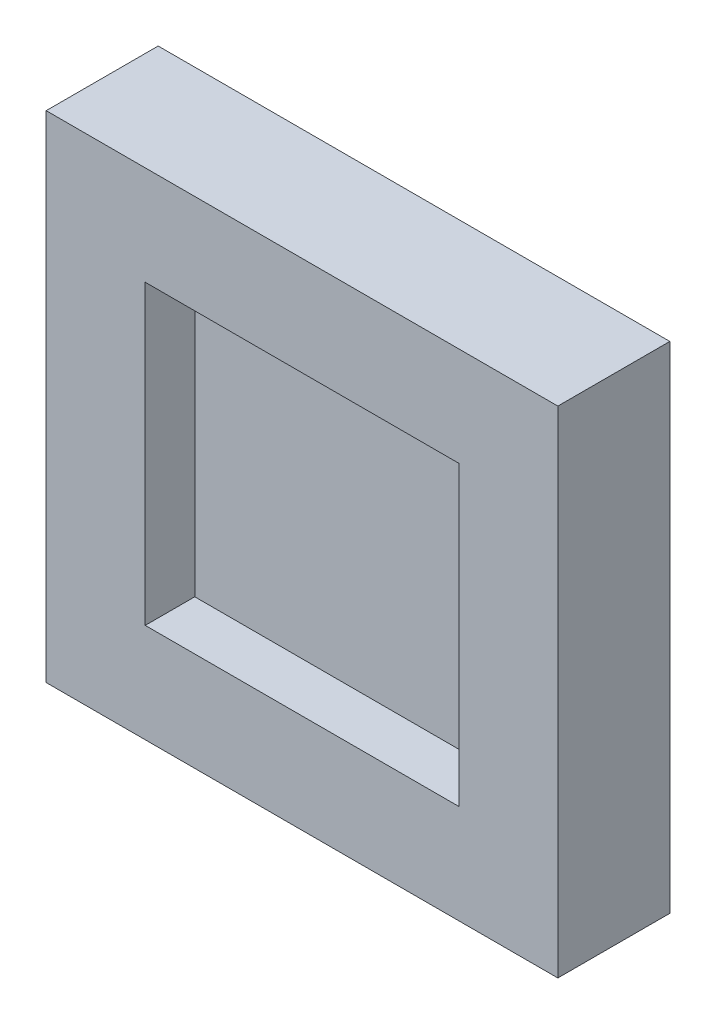
ISO-10303-21;
HEADER;
FILE_DESCRIPTION(('STEP AP214'),'2;1');
FILE_NAME('part.step','',(''),(''),'','','');
FILE_SCHEMA(('AUTOMOTIVE_DESIGN { 1 0 10303 214 1 1 1 1 }'));
ENDSEC;
DATA;
#1=APPLICATION_CONTEXT('core data for automotive mechanical design processes');
#2=APPLICATION_PROTOCOL_DEFINITION('international standard','automotive_design',2000,#1);
#3=PRODUCT_CONTEXT('',#1,'mechanical');
#4=PRODUCT('Part','Part','',(#3));
#5=PRODUCT_RELATED_PRODUCT_CATEGORY('part','',(#4));
#6=PRODUCT_DEFINITION_FORMATION('','',#4);
#7=PRODUCT_DEFINITION_CONTEXT('part definition',#1,'design');
#8=PRODUCT_DEFINITION('design','',#6,#7);
#9=PRODUCT_DEFINITION_SHAPE('','',#8);
#10=(LENGTH_UNIT() NAMED_UNIT(*) SI_UNIT(.MILLI.,.METRE.));
#11=(NAMED_UNIT(*) PLANE_ANGLE_UNIT() SI_UNIT($,.RADIAN.));
#12=(NAMED_UNIT(*) SI_UNIT($,.STERADIAN.) SOLID_ANGLE_UNIT());
#13=UNCERTAINTY_MEASURE_WITH_UNIT(LENGTH_MEASURE(1.E-05),#10,'distance_accuracy_value','');
#14=(GEOMETRIC_REPRESENTATION_CONTEXT(3) GLOBAL_UNCERTAINTY_ASSIGNED_CONTEXT((#13)) GLOBAL_UNIT_ASSIGNED_CONTEXT((#10,
#11,#12)) REPRESENTATION_CONTEXT('',''));
#15=CARTESIAN_POINT('',(0.,0.,0.));
#16=DIRECTION('',(0.,0.,1.));
#17=DIRECTION('',(1.,0.,0.));
#18=AXIS2_PLACEMENT_3D('',#15,#16,#17);
#19=CARTESIAN_POINT('',(297.,287.5,-65.));
#20=DIRECTION('',(0.,1.,0.));
#21=DIRECTION('',(-1.,0.,0.));
#22=AXIS2_PLACEMENT_3D('',#19,#20,#21);
#23=PLANE('',#22);
#24=DIRECTION('',(0.,0.,1.));
#25=VECTOR('',#24,1.);
#26=CARTESIAN_POINT('',(-297.,287.5,-65.));
#27=LINE('',#26,#25);
#28=CARTESIAN_POINT('',(-297.,287.5,-65.));
#29=VERTEX_POINT('',#28);
#30=CARTESIAN_POINT('',(-297.,287.5,65.));
#31=VERTEX_POINT('',#30);
#32=EDGE_CURVE('E62',#29,#31,#27,.T.);
#33=ORIENTED_EDGE('',*,*,#32,.T.);
#34=DIRECTION('',(-1.,0.,0.));
#35=VECTOR('',#34,1.);
#36=CARTESIAN_POINT('',(297.,287.5,65.));
#37=LINE('',#36,#35);
#38=CARTESIAN_POINT('',(297.,287.5,65.));
#39=VERTEX_POINT('',#38);
#40=EDGE_CURVE('E160',#39,#31,#37,.T.);
#41=ORIENTED_EDGE('',*,*,#40,.F.);
#42=DIRECTION('',(0.,0.,1.));
#43=VECTOR('',#42,1.);
#44=CARTESIAN_POINT('',(297.,287.5,-65.));
#45=LINE('',#44,#43);
#46=CARTESIAN_POINT('',(297.,287.5,-65.));
#47=VERTEX_POINT('',#46);
#48=EDGE_CURVE('E12',#47,#39,#45,.T.);
#49=ORIENTED_EDGE('',*,*,#48,.F.);
#50=DIRECTION('',(-1.,0.,0.));
#51=VECTOR('',#50,1.);
#52=CARTESIAN_POINT('',(297.,287.5,-65.));
#53=LINE('',#52,#51);
#54=EDGE_CURVE('E188',#47,#29,#53,.T.);
#55=ORIENTED_EDGE('',*,*,#54,.T.);
#56=EDGE_LOOP('',(#33,#41,#49,#55));
#57=FACE_BOUND('',#56,.T.);
#58=ADVANCED_FACE('F59',(#57),#23,.T.);
#59=CARTESIAN_POINT('',(297.,-287.5,-65.));
#60=DIRECTION('',(1.,0.,0.));
#61=DIRECTION('',(0.,1.,0.));
#62=AXIS2_PLACEMENT_3D('',#59,#60,#61);
#63=PLANE('',#62);
#64=ORIENTED_EDGE('',*,*,#48,.T.);
#65=DIRECTION('',(0.,1.,0.));
#66=VECTOR('',#65,1.);
#67=CARTESIAN_POINT('',(297.,-287.5,65.));
#68=LINE('',#67,#66);
#69=CARTESIAN_POINT('',(297.,-287.5,65.));
#70=VERTEX_POINT('',#69);
#71=EDGE_CURVE('E172',#70,#39,#68,.T.);
#72=ORIENTED_EDGE('',*,*,#71,.F.);
#73=DIRECTION('',(0.,0.,1.));
#74=VECTOR('',#73,1.);
#75=CARTESIAN_POINT('',(297.,-287.5,-65.));
#76=LINE('',#75,#74);
#77=CARTESIAN_POINT('',(297.,-287.5,-65.));
#78=VERTEX_POINT('',#77);
#79=EDGE_CURVE('E68',#78,#70,#76,.T.);
#80=ORIENTED_EDGE('',*,*,#79,.F.);
#81=DIRECTION('',(0.,1.,0.));
#82=VECTOR('',#81,1.);
#83=CARTESIAN_POINT('',(297.,-287.5,-65.));
#84=LINE('',#83,#82);
#85=EDGE_CURVE('E204',#78,#47,#84,.T.);
#86=ORIENTED_EDGE('',*,*,#85,.T.);
#87=EDGE_LOOP('',(#64,#72,#80,#86));
#88=FACE_BOUND('',#87,.T.);
#89=ADVANCED_FACE('F220',(#88),#63,.T.);
#90=CARTESIAN_POINT('',(-297.,-287.5,-65.));
#91=DIRECTION('',(0.,-1.,0.));
#92=DIRECTION('',(1.,0.,0.));
#93=AXIS2_PLACEMENT_3D('',#90,#91,#92);
#94=PLANE('',#93);
#95=ORIENTED_EDGE('',*,*,#79,.T.);
#96=DIRECTION('',(1.,0.,0.));
#97=VECTOR('',#96,1.);
#98=CARTESIAN_POINT('',(-297.,-287.5,65.));
#99=LINE('',#98,#97);
#100=CARTESIAN_POINT('',(-297.,-287.5,65.));
#101=VERTEX_POINT('',#100);
#102=EDGE_CURVE('E168',#101,#70,#99,.T.);
#103=ORIENTED_EDGE('',*,*,#102,.F.);
#104=DIRECTION('',(0.,0.,1.));
#105=VECTOR('',#104,1.);
#106=CARTESIAN_POINT('',(-297.,-287.5,-65.));
#107=LINE('',#106,#105);
#108=CARTESIAN_POINT('',(-297.,-287.5,-65.));
#109=VERTEX_POINT('',#108);
#110=EDGE_CURVE('E209',#109,#101,#107,.T.);
#111=ORIENTED_EDGE('',*,*,#110,.F.);
#112=DIRECTION('',(1.,0.,0.));
#113=VECTOR('',#112,1.);
#114=CARTESIAN_POINT('',(-297.,-287.5,-65.));
#115=LINE('',#114,#113);
#116=EDGE_CURVE('E200',#109,#78,#115,.T.);
#117=ORIENTED_EDGE('',*,*,#116,.T.);
#118=EDGE_LOOP('',(#95,#103,#111,#117));
#119=FACE_BOUND('',#118,.T.);
#120=ADVANCED_FACE('F226',(#119),#94,.T.);
#121=CARTESIAN_POINT('',(-297.,287.5,-65.));
#122=DIRECTION('',(-1.,0.,0.));
#123=DIRECTION('',(0.,-1.,0.));
#124=AXIS2_PLACEMENT_3D('',#121,#122,#123);
#125=PLANE('',#124);
#126=ORIENTED_EDGE('',*,*,#110,.T.);
#127=DIRECTION('',(0.,-1.,0.));
#128=VECTOR('',#127,1.);
#129=CARTESIAN_POINT('',(-297.,287.5,65.));
#130=LINE('',#129,#128);
#131=EDGE_CURVE('E164',#31,#101,#130,.T.);
#132=ORIENTED_EDGE('',*,*,#131,.F.);
#133=ORIENTED_EDGE('',*,*,#32,.F.);
#134=DIRECTION('',(0.,-1.,0.));
#135=VECTOR('',#134,1.);
#136=CARTESIAN_POINT('',(-297.,287.5,-65.));
#137=LINE('',#136,#135);
#138=EDGE_CURVE('E196',#29,#109,#137,.T.);
#139=ORIENTED_EDGE('',*,*,#138,.T.);
#140=EDGE_LOOP('',(#126,#132,#133,#139));
#141=FACE_BOUND('',#140,.T.);
#142=ADVANCED_FACE('F215',(#141),#125,.T.);
#143=CARTESIAN_POINT('',(0.,0.,-65.));
#144=DIRECTION('',(0.,0.,1.));
#145=DIRECTION('',(1.,0.,0.));
#146=AXIS2_PLACEMENT_3D('',#143,#144,#145);
#147=PLANE('',#146);
#148=DIRECTION('',(-1.,0.,0.));
#149=VECTOR('',#148,1.);
#150=CARTESIAN_POINT('',(182.,172.5,-65.));
#151=LINE('',#150,#149);
#152=CARTESIAN_POINT('',(182.,172.5,-65.));
#153=VERTEX_POINT('',#152);
#154=CARTESIAN_POINT('',(-182.,172.5,-65.));
#155=VERTEX_POINT('',#154);
#156=EDGE_CURVE('E138',#153,#155,#151,.T.);
#157=ORIENTED_EDGE('',*,*,#156,.T.);
#158=DIRECTION('',(0.,-1.,0.));
#159=VECTOR('',#158,1.);
#160=CARTESIAN_POINT('',(-182.,172.5,-65.));
#161=LINE('',#160,#159);
#162=CARTESIAN_POINT('',(-182.,-172.5,-65.));
#163=VERTEX_POINT('',#162);
#164=EDGE_CURVE('E176',#155,#163,#161,.T.);
#165=ORIENTED_EDGE('',*,*,#164,.T.);
#166=DIRECTION('',(1.,0.,0.));
#167=VECTOR('',#166,1.);
#168=CARTESIAN_POINT('',(182.,-172.5,-65.));
#169=LINE('',#168,#167);
#170=CARTESIAN_POINT('',(182.,-172.5,-65.));
#171=VERTEX_POINT('',#170);
#172=EDGE_CURVE('E132',#163,#171,#169,.T.);
#173=ORIENTED_EDGE('',*,*,#172,.T.);
#174=DIRECTION('',(0.,1.,0.));
#175=VECTOR('',#174,1.);
#176=CARTESIAN_POINT('',(182.,172.5,-65.));
#177=LINE('',#176,#175);
#178=EDGE_CURVE('E76',#171,#153,#177,.T.);
#179=ORIENTED_EDGE('',*,*,#178,.T.);
#180=EDGE_LOOP('',(#157,#165,#173,#179));
#181=FACE_BOUND('',#180,.T.);
#182=ORIENTED_EDGE('',*,*,#54,.F.);
#183=ORIENTED_EDGE('',*,*,#85,.F.);
#184=ORIENTED_EDGE('',*,*,#116,.F.);
#185=ORIENTED_EDGE('',*,*,#138,.F.);
#186=EDGE_LOOP('',(#182,#183,#184,#185));
#187=FACE_BOUND('',#186,.T.);
#188=ADVANCED_FACE('F224',(#181,#187),#147,.F.);
#189=CARTESIAN_POINT('',(-182.,172.5,-65.));
#190=DIRECTION('',(-1.,0.,0.));
#191=DIRECTION('',(0.,0.,1.));
#192=AXIS2_PLACEMENT_3D('',#189,#190,#191);
#193=PLANE('',#192);
#194=DIRECTION('',(0.,0.,1.));
#195=VECTOR('',#194,1.);
#196=CARTESIAN_POINT('',(-182.,172.5,-65.));
#197=LINE('',#196,#195);
#198=CARTESIAN_POINT('',(-182.,172.5,65.));
#199=VERTEX_POINT('',#198);
#200=EDGE_CURVE('E143',#155,#199,#197,.T.);
#201=ORIENTED_EDGE('',*,*,#200,.T.);
#202=DIRECTION('',(0.,-1.,0.));
#203=VECTOR('',#202,1.);
#204=CARTESIAN_POINT('',(-182.,172.5,65.));
#205=LINE('',#204,#203);
#206=CARTESIAN_POINT('',(-182.,-172.5,65.));
#207=VERTEX_POINT('',#206);
#208=EDGE_CURVE('E141',#199,#207,#205,.T.);
#209=ORIENTED_EDGE('',*,*,#208,.T.);
#210=DIRECTION('',(0.,0.,1.));
#211=VECTOR('',#210,1.);
#212=CARTESIAN_POINT('',(-182.,-172.5,-65.));
#213=LINE('',#212,#211);
#214=EDGE_CURVE('E125',#163,#207,#213,.T.);
#215=ORIENTED_EDGE('',*,*,#214,.F.);
#216=ORIENTED_EDGE('',*,*,#164,.F.);
#217=EDGE_LOOP('',(#201,#209,#215,#216));
#218=FACE_BOUND('',#217,.T.);
#219=ADVANCED_FACE('F142',(#218),#193,.F.);
#220=CARTESIAN_POINT('',(182.,172.5,-65.));
#221=DIRECTION('',(0.,1.,0.));
#222=DIRECTION('',(0.,0.,1.));
#223=AXIS2_PLACEMENT_3D('',#220,#221,#222);
#224=PLANE('',#223);
#225=DIRECTION('',(0.,0.,1.));
#226=VECTOR('',#225,1.);
#227=CARTESIAN_POINT('',(182.,172.5,-65.));
#228=LINE('',#227,#226);
#229=CARTESIAN_POINT('',(182.,172.5,65.));
#230=VERTEX_POINT('',#229);
#231=EDGE_CURVE('E189',#153,#230,#228,.T.);
#232=ORIENTED_EDGE('',*,*,#231,.T.);
#233=DIRECTION('',(-1.,0.,0.));
#234=VECTOR('',#233,1.);
#235=CARTESIAN_POINT('',(182.,172.5,65.));
#236=LINE('',#235,#234);
#237=EDGE_CURVE('E155',#230,#199,#236,.T.);
#238=ORIENTED_EDGE('',*,*,#237,.T.);
#239=ORIENTED_EDGE('',*,*,#200,.F.);
#240=ORIENTED_EDGE('',*,*,#156,.F.);
#241=EDGE_LOOP('',(#232,#238,#239,#240));
#242=FACE_BOUND('',#241,.T.);
#243=ADVANCED_FACE('F269',(#242),#224,.F.);
#244=CARTESIAN_POINT('',(182.,172.5,-65.));
#245=DIRECTION('',(1.,0.,0.));
#246=DIRECTION('',(0.,0.,-1.));
#247=AXIS2_PLACEMENT_3D('',#244,#245,#246);
#248=PLANE('',#247);
#249=DIRECTION('',(0.,0.,1.));
#250=VECTOR('',#249,1.);
#251=CARTESIAN_POINT('',(182.,-172.5,-65.));
#252=LINE('',#251,#250);
#253=CARTESIAN_POINT('',(182.,-172.5,65.));
#254=VERTEX_POINT('',#253);
#255=EDGE_CURVE('E137',#171,#254,#252,.T.);
#256=ORIENTED_EDGE('',*,*,#255,.T.);
#257=DIRECTION('',(0.,1.,0.));
#258=VECTOR('',#257,1.);
#259=CARTESIAN_POINT('',(182.,172.5,65.));
#260=LINE('',#259,#258);
#261=EDGE_CURVE('E151',#254,#230,#260,.T.);
#262=ORIENTED_EDGE('',*,*,#261,.T.);
#263=ORIENTED_EDGE('',*,*,#231,.F.);
#264=ORIENTED_EDGE('',*,*,#178,.F.);
#265=EDGE_LOOP('',(#256,#262,#263,#264));
#266=FACE_BOUND('',#265,.T.);
#267=ADVANCED_FACE('F278',(#266),#248,.F.);
#268=CARTESIAN_POINT('',(182.,-172.5,-65.));
#269=DIRECTION('',(0.,-1.,0.));
#270=DIRECTION('',(0.,0.,-1.));
#271=AXIS2_PLACEMENT_3D('',#268,#269,#270);
#272=PLANE('',#271);
#273=ORIENTED_EDGE('',*,*,#214,.T.);
#274=DIRECTION('',(1.,0.,0.));
#275=VECTOR('',#274,1.);
#276=CARTESIAN_POINT('',(182.,-172.5,65.));
#277=LINE('',#276,#275);
#278=EDGE_CURVE('E129',#207,#254,#277,.T.);
#279=ORIENTED_EDGE('',*,*,#278,.T.);
#280=ORIENTED_EDGE('',*,*,#255,.F.);
#281=ORIENTED_EDGE('',*,*,#172,.F.);
#282=EDGE_LOOP('',(#273,#279,#280,#281));
#283=FACE_BOUND('',#282,.T.);
#284=ADVANCED_FACE('F127',(#283),#272,.F.);
#285=CARTESIAN_POINT('',(0.,0.,65.));
#286=DIRECTION('',(0.,0.,1.));
#287=DIRECTION('',(1.,0.,0.));
#288=AXIS2_PLACEMENT_3D('',#285,#286,#287);
#289=PLANE('',#288);
#290=ORIENTED_EDGE('',*,*,#40,.T.);
#291=ORIENTED_EDGE('',*,*,#131,.T.);
#292=ORIENTED_EDGE('',*,*,#102,.T.);
#293=ORIENTED_EDGE('',*,*,#71,.T.);
#294=EDGE_LOOP('',(#290,#291,#292,#293));
#295=FACE_BOUND('',#294,.T.);
#296=ORIENTED_EDGE('',*,*,#278,.F.);
#297=ORIENTED_EDGE('',*,*,#208,.F.);
#298=ORIENTED_EDGE('',*,*,#237,.F.);
#299=ORIENTED_EDGE('',*,*,#261,.F.);
#300=EDGE_LOOP('',(#296,#297,#298,#299));
#301=FACE_BOUND('',#300,.T.);
#302=ADVANCED_FACE('F149',(#295,#301),#289,.T.);
#303=CLOSED_SHELL('',(#58,#89,#120,#142,#188,#219,#243,#267,#284,#302));
#304=MANIFOLD_SOLID_BREP('B2',#303);
#305=CARTESIAN_POINT('',(-182.,172.5,-7.5));
#306=DIRECTION('',(-1.,0.,0.));
#307=DIRECTION('',(0.,-1.,0.));
#308=AXIS2_PLACEMENT_3D('',#305,#306,#307);
#309=PLANE('',#308);
#310=DIRECTION('',(0.,0.,1.));
#311=VECTOR('',#310,1.);
#312=CARTESIAN_POINT('',(-182.,-172.5,-7.5));
#313=LINE('',#312,#311);
#314=CARTESIAN_POINT('',(-182.,-172.5,-7.5));
#315=VERTEX_POINT('',#314);
#316=CARTESIAN_POINT('',(-182.,-172.5,7.5));
#317=VERTEX_POINT('',#316);
#318=EDGE_CURVE('E356',#315,#317,#313,.T.);
#319=ORIENTED_EDGE('',*,*,#318,.T.);
#320=DIRECTION('',(0.,-1.,0.));
#321=VECTOR('',#320,1.);
#322=CARTESIAN_POINT('',(-182.,172.5,7.5));
#323=LINE('',#322,#321);
#324=CARTESIAN_POINT('',(-182.,172.5,7.5));
#325=VERTEX_POINT('',#324);
#326=EDGE_CURVE('E393',#325,#317,#323,.T.);
#327=ORIENTED_EDGE('',*,*,#326,.F.);
#328=DIRECTION('',(0.,0.,1.));
#329=VECTOR('',#328,1.);
#330=CARTESIAN_POINT('',(-182.,172.5,-7.5));
#331=LINE('',#330,#329);
#332=CARTESIAN_POINT('',(-182.,172.5,-7.5));
#333=VERTEX_POINT('',#332);
#334=EDGE_CURVE('E57',#333,#325,#331,.T.);
#335=ORIENTED_EDGE('',*,*,#334,.F.);
#336=DIRECTION('',(0.,-1.,0.));
#337=VECTOR('',#336,1.);
#338=CARTESIAN_POINT('',(-182.,172.5,-7.5));
#339=LINE('',#338,#337);
#340=EDGE_CURVE('E394',#333,#315,#339,.T.);
#341=ORIENTED_EDGE('',*,*,#340,.T.);
#342=EDGE_LOOP('',(#319,#327,#335,#341));
#343=FACE_BOUND('',#342,.T.);
#344=ADVANCED_FACE('F353',(#343),#309,.T.);
#345=CARTESIAN_POINT('',(182.,172.5,-7.5));
#346=DIRECTION('',(0.,1.,0.));
#347=DIRECTION('',(-1.,0.,0.));
#348=AXIS2_PLACEMENT_3D('',#345,#346,#347);
#349=PLANE('',#348);
#350=ORIENTED_EDGE('',*,*,#334,.T.);
#351=DIRECTION('',(-1.,0.,0.));
#352=VECTOR('',#351,1.);
#353=CARTESIAN_POINT('',(182.,172.5,7.5));
#354=LINE('',#353,#352);
#355=CARTESIAN_POINT('',(182.,172.5,7.5));
#356=VERTEX_POINT('',#355);
#357=EDGE_CURVE('E410',#356,#325,#354,.T.);
#358=ORIENTED_EDGE('',*,*,#357,.F.);
#359=DIRECTION('',(0.,0.,1.));
#360=VECTOR('',#359,1.);
#361=CARTESIAN_POINT('',(182.,172.5,-7.5));
#362=LINE('',#361,#360);
#363=CARTESIAN_POINT('',(182.,172.5,-7.5));
#364=VERTEX_POINT('',#363);
#365=EDGE_CURVE('E361',#364,#356,#362,.T.);
#366=ORIENTED_EDGE('',*,*,#365,.F.);
#367=DIRECTION('',(-1.,0.,0.));
#368=VECTOR('',#367,1.);
#369=CARTESIAN_POINT('',(182.,172.5,-7.5));
#370=LINE('',#369,#368);
#371=EDGE_CURVE('E399',#364,#333,#370,.T.);
#372=ORIENTED_EDGE('',*,*,#371,.T.);
#373=EDGE_LOOP('',(#350,#358,#366,#372));
#374=FACE_BOUND('',#373,.T.);
#375=ADVANCED_FACE('F425',(#374),#349,.T.);
#376=CARTESIAN_POINT('',(182.,172.5,-7.5));
#377=DIRECTION('',(1.,0.,0.));
#378=DIRECTION('',(0.,1.,0.));
#379=AXIS2_PLACEMENT_3D('',#376,#377,#378);
#380=PLANE('',#379);
#381=ORIENTED_EDGE('',*,*,#365,.T.);
#382=DIRECTION('',(0.,1.,0.));
#383=VECTOR('',#382,1.);
#384=CARTESIAN_POINT('',(182.,172.5,7.5));
#385=LINE('',#384,#383);
#386=CARTESIAN_POINT('',(182.,-172.5,7.5));
#387=VERTEX_POINT('',#386);
#388=EDGE_CURVE('E406',#387,#356,#385,.T.);
#389=ORIENTED_EDGE('',*,*,#388,.F.);
#390=DIRECTION('',(0.,0.,1.));
#391=VECTOR('',#390,1.);
#392=CARTESIAN_POINT('',(182.,-172.5,-7.5));
#393=LINE('',#392,#391);
#394=CARTESIAN_POINT('',(182.,-172.5,-7.5));
#395=VERTEX_POINT('',#394);
#396=EDGE_CURVE('E398',#395,#387,#393,.T.);
#397=ORIENTED_EDGE('',*,*,#396,.F.);
#398=DIRECTION('',(0.,1.,0.));
#399=VECTOR('',#398,1.);
#400=CARTESIAN_POINT('',(182.,172.5,-7.5));
#401=LINE('',#400,#399);
#402=EDGE_CURVE('E418',#395,#364,#401,.T.);
#403=ORIENTED_EDGE('',*,*,#402,.T.);
#404=EDGE_LOOP('',(#381,#389,#397,#403));
#405=FACE_BOUND('',#404,.T.);
#406=ADVANCED_FACE('F422',(#405),#380,.T.);
#407=CARTESIAN_POINT('',(182.,-172.5,-7.5));
#408=DIRECTION('',(0.,-1.,0.));
#409=DIRECTION('',(1.,0.,0.));
#410=AXIS2_PLACEMENT_3D('',#407,#408,#409);
#411=PLANE('',#410);
#412=ORIENTED_EDGE('',*,*,#396,.T.);
#413=DIRECTION('',(1.,0.,0.));
#414=VECTOR('',#413,1.);
#415=CARTESIAN_POINT('',(182.,-172.5,7.5));
#416=LINE('',#415,#414);
#417=EDGE_CURVE('E401',#317,#387,#416,.T.);
#418=ORIENTED_EDGE('',*,*,#417,.F.);
#419=ORIENTED_EDGE('',*,*,#318,.F.);
#420=DIRECTION('',(1.,0.,0.));
#421=VECTOR('',#420,1.);
#422=CARTESIAN_POINT('',(182.,-172.5,-7.5));
#423=LINE('',#422,#421);
#424=EDGE_CURVE('E416',#315,#395,#423,.T.);
#425=ORIENTED_EDGE('',*,*,#424,.T.);
#426=EDGE_LOOP('',(#412,#418,#419,#425));
#427=FACE_BOUND('',#426,.T.);
#428=ADVANCED_FACE('F402',(#427),#411,.T.);
#429=CARTESIAN_POINT('',(0.,0.,-7.5));
#430=DIRECTION('',(0.,0.,-1.));
#431=DIRECTION('',(-1.,0.,0.));
#432=AXIS2_PLACEMENT_3D('',#429,#430,#431);
#433=PLANE('',#432);
#434=ORIENTED_EDGE('',*,*,#340,.F.);
#435=ORIENTED_EDGE('',*,*,#371,.F.);
#436=ORIENTED_EDGE('',*,*,#402,.F.);
#437=ORIENTED_EDGE('',*,*,#424,.F.);
#438=EDGE_LOOP('',(#434,#435,#436,#437));
#439=FACE_BOUND('',#438,.T.);
#440=ADVANCED_FACE('F427',(#439),#433,.T.);
#441=CARTESIAN_POINT('',(0.,0.,7.5));
#442=DIRECTION('',(0.,0.,-1.));
#443=DIRECTION('',(-1.,0.,0.));
#444=AXIS2_PLACEMENT_3D('',#441,#442,#443);
#445=PLANE('',#444);
#446=ORIENTED_EDGE('',*,*,#326,.T.);
#447=ORIENTED_EDGE('',*,*,#417,.T.);
#448=ORIENTED_EDGE('',*,*,#388,.T.);
#449=ORIENTED_EDGE('',*,*,#357,.T.);
#450=EDGE_LOOP('',(#446,#447,#448,#449));
#451=FACE_BOUND('',#450,.T.);
#452=ADVANCED_FACE('F409',(#451),#445,.F.);
#453=CLOSED_SHELL('',(#344,#375,#406,#428,#440,#452));
#454=MANIFOLD_SOLID_BREP('B6',#453);
#455=ADVANCED_BREP_SHAPE_REPRESENTATION('',(#18,#304,#454),#14);
#456=SHAPE_DEFINITION_REPRESENTATION(#9,#455);
ENDSEC;
END-ISO-10303-21;
